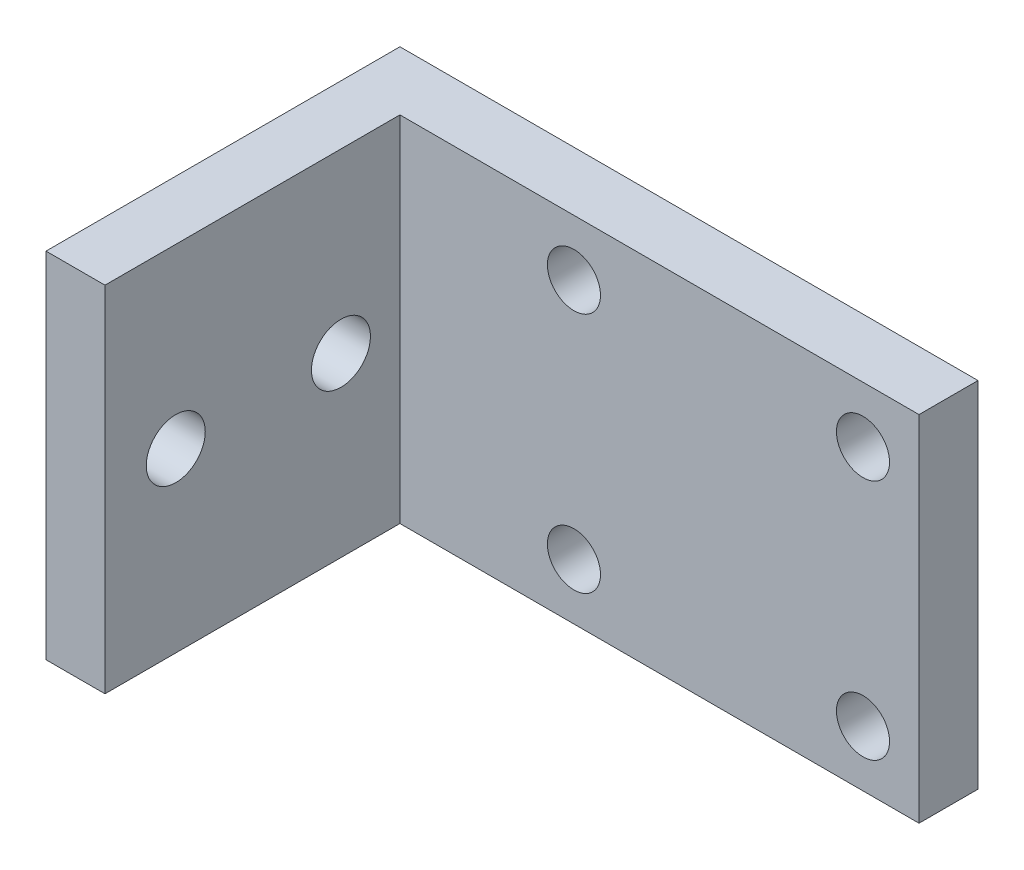
ISO-10303-21;
HEADER;
FILE_DESCRIPTION(('STEP AP214'),'2;1');
FILE_NAME('part.step','',(''),(''),'','','');
FILE_SCHEMA(('AUTOMOTIVE_DESIGN { 1 0 10303 214 1 1 1 1 }'));
ENDSEC;
DATA;
#1=APPLICATION_CONTEXT('core data for automotive mechanical design processes');
#2=APPLICATION_PROTOCOL_DEFINITION('international standard','automotive_design',2000,#1);
#3=PRODUCT_CONTEXT('',#1,'mechanical');
#4=PRODUCT('Part','Part','',(#3));
#5=PRODUCT_RELATED_PRODUCT_CATEGORY('part','',(#4));
#6=PRODUCT_DEFINITION_FORMATION('','',#4);
#7=PRODUCT_DEFINITION_CONTEXT('part definition',#1,'design');
#8=PRODUCT_DEFINITION('design','',#6,#7);
#9=PRODUCT_DEFINITION_SHAPE('','',#8);
#10=(LENGTH_UNIT() NAMED_UNIT(*) SI_UNIT(.MILLI.,.METRE.));
#11=(NAMED_UNIT(*) PLANE_ANGLE_UNIT() SI_UNIT($,.RADIAN.));
#12=(NAMED_UNIT(*) SI_UNIT($,.STERADIAN.) SOLID_ANGLE_UNIT());
#13=UNCERTAINTY_MEASURE_WITH_UNIT(LENGTH_MEASURE(1.E-05),#10,'distance_accuracy_value','');
#14=(GEOMETRIC_REPRESENTATION_CONTEXT(3) GLOBAL_UNCERTAINTY_ASSIGNED_CONTEXT((#13)) GLOBAL_UNIT_ASSIGNED_CONTEXT((#10,
#11,#12)) REPRESENTATION_CONTEXT('',''));
#15=CARTESIAN_POINT('',(0.,0.,0.));
#16=DIRECTION('',(0.,0.,1.));
#17=DIRECTION('',(1.,0.,0.));
#18=AXIS2_PLACEMENT_3D('',#15,#16,#17);
#19=CARTESIAN_POINT('',(0.,0.,5.));
#20=DIRECTION('',(0.,0.,-1.));
#21=DIRECTION('',(-1.,0.,0.));
#22=AXIS2_PLACEMENT_3D('',#19,#20,#21);
#23=PLANE('',#22);
#24=CARTESIAN_POINT('',(4.75,4.75,5.));
#25=DIRECTION('',(0.,0.,1.));
#26=DIRECTION('',(1.,0.,0.));
#27=AXIS2_PLACEMENT_3D('',#24,#25,#26);
#28=CIRCLE('',#27,2.25);
#29=CARTESIAN_POINT('',(7.,4.75,5.));
#30=VERTEX_POINT('',#29);
#31=EDGE_CURVE('E116',#30,#30,#28,.T.);
#32=ORIENTED_EDGE('',*,*,#31,.F.);
#33=EDGE_LOOP('',(#32));
#34=FACE_BOUND('',#33,.T.);
#35=CARTESIAN_POINT('',(29.25,4.75,5.));
#36=DIRECTION('',(0.,0.,1.));
#37=DIRECTION('',(1.,0.,0.));
#38=AXIS2_PLACEMENT_3D('',#35,#36,#37);
#39=CIRCLE('',#38,2.25);
#40=CARTESIAN_POINT('',(31.5,4.75,5.));
#41=VERTEX_POINT('',#40);
#42=EDGE_CURVE('E110',#41,#41,#39,.T.);
#43=ORIENTED_EDGE('',*,*,#42,.F.);
#44=EDGE_LOOP('',(#43));
#45=FACE_BOUND('',#44,.T.);
#46=CARTESIAN_POINT('',(29.25,25.25,5.));
#47=DIRECTION('',(0.,0.,1.));
#48=DIRECTION('',(1.,0.,0.));
#49=AXIS2_PLACEMENT_3D('',#46,#47,#48);
#50=CIRCLE('',#49,2.25000000000001);
#51=CARTESIAN_POINT('',(31.5,25.25,5.));
#52=VERTEX_POINT('',#51);
#53=EDGE_CURVE('E104',#52,#52,#50,.T.);
#54=ORIENTED_EDGE('',*,*,#53,.F.);
#55=EDGE_LOOP('',(#54));
#56=FACE_BOUND('',#55,.T.);
#57=CARTESIAN_POINT('',(4.75,25.25,5.));
#58=DIRECTION('',(0.,0.,1.));
#59=DIRECTION('',(1.,0.,0.));
#60=AXIS2_PLACEMENT_3D('',#57,#58,#59);
#61=CIRCLE('',#60,2.25);
#62=CARTESIAN_POINT('',(7.,25.25,5.));
#63=VERTEX_POINT('',#62);
#64=EDGE_CURVE('E98',#63,#63,#61,.T.);
#65=ORIENTED_EDGE('',*,*,#64,.F.);
#66=EDGE_LOOP('',(#65));
#67=FACE_BOUND('',#66,.T.);
#68=DIRECTION('',(0.,1.,0.));
#69=VECTOR('',#68,1.);
#70=CARTESIAN_POINT('',(-10.,0.,5.));
#71=LINE('',#70,#69);
#72=CARTESIAN_POINT('',(-10.,0.,5.));
#73=VERTEX_POINT('',#72);
#74=CARTESIAN_POINT('',(-10.,30.,5.));
#75=VERTEX_POINT('',#74);
#76=EDGE_CURVE('E52',#73,#75,#71,.T.);
#77=ORIENTED_EDGE('',*,*,#76,.F.);
#78=DIRECTION('',(1.,0.,0.));
#79=VECTOR('',#78,1.);
#80=CARTESIAN_POINT('',(0.,0.,5.));
#81=LINE('',#80,#79);
#82=CARTESIAN_POINT('',(34.,0.,5.));
#83=VERTEX_POINT('',#82);
#84=EDGE_CURVE('E93',#73,#83,#81,.T.);
#85=ORIENTED_EDGE('',*,*,#84,.T.);
#86=DIRECTION('',(0.,1.,0.));
#87=VECTOR('',#86,1.);
#88=CARTESIAN_POINT('',(34.,0.,5.));
#89=LINE('',#88,#87);
#90=CARTESIAN_POINT('',(34.,30.,5.));
#91=VERTEX_POINT('',#90);
#92=EDGE_CURVE('E58',#83,#91,#89,.T.);
#93=ORIENTED_EDGE('',*,*,#92,.T.);
#94=DIRECTION('',(-1.,0.,0.));
#95=VECTOR('',#94,1.);
#96=CARTESIAN_POINT('',(0.,30.,5.));
#97=LINE('',#96,#95);
#98=EDGE_CURVE('E87',#91,#75,#97,.T.);
#99=ORIENTED_EDGE('',*,*,#98,.T.);
#100=EDGE_LOOP('',(#77,#85,#93,#99));
#101=FACE_BOUND('',#100,.T.);
#102=ADVANCED_FACE('F37',(#34,#45,#56,#67,#101),#23,.F.);
#103=CARTESIAN_POINT('',(0.,0.,0.));
#104=DIRECTION('',(0.,0.,-1.));
#105=DIRECTION('',(-1.,0.,0.));
#106=AXIS2_PLACEMENT_3D('',#103,#104,#105);
#107=PLANE('',#106);
#108=CARTESIAN_POINT('',(29.25,4.75,0.));
#109=DIRECTION('',(0.,0.,1.));
#110=DIRECTION('',(1.,0.,0.));
#111=AXIS2_PLACEMENT_3D('',#108,#109,#110);
#112=CIRCLE('',#111,2.25);
#113=CARTESIAN_POINT('',(31.5,4.75,0.));
#114=VERTEX_POINT('',#113);
#115=EDGE_CURVE('E113',#114,#114,#112,.T.);
#116=ORIENTED_EDGE('',*,*,#115,.T.);
#117=EDGE_LOOP('',(#116));
#118=FACE_BOUND('',#117,.T.);
#119=CARTESIAN_POINT('',(4.75,25.25,0.));
#120=DIRECTION('',(0.,0.,1.));
#121=DIRECTION('',(1.,0.,0.));
#122=AXIS2_PLACEMENT_3D('',#119,#120,#121);
#123=CIRCLE('',#122,2.25);
#124=CARTESIAN_POINT('',(7.,25.25,0.));
#125=VERTEX_POINT('',#124);
#126=EDGE_CURVE('E101',#125,#125,#123,.T.);
#127=ORIENTED_EDGE('',*,*,#126,.T.);
#128=EDGE_LOOP('',(#127));
#129=FACE_BOUND('',#128,.T.);
#130=DIRECTION('',(1.,0.,0.));
#131=VECTOR('',#130,1.);
#132=CARTESIAN_POINT('',(0.,0.,0.));
#133=LINE('',#132,#131);
#134=CARTESIAN_POINT('',(-15.,0.,0.));
#135=VERTEX_POINT('',#134);
#136=CARTESIAN_POINT('',(34.,0.,0.));
#137=VERTEX_POINT('',#136);
#138=EDGE_CURVE('E79',#135,#137,#133,.T.);
#139=ORIENTED_EDGE('',*,*,#138,.F.);
#140=DIRECTION('',(0.,-1.,0.));
#141=VECTOR('',#140,1.);
#142=CARTESIAN_POINT('',(-15.,30.,0.));
#143=LINE('',#142,#141);
#144=CARTESIAN_POINT('',(-15.,30.,0.));
#145=VERTEX_POINT('',#144);
#146=EDGE_CURVE('E92',#145,#135,#143,.T.);
#147=ORIENTED_EDGE('',*,*,#146,.F.);
#148=DIRECTION('',(-1.,0.,0.));
#149=VECTOR('',#148,1.);
#150=CARTESIAN_POINT('',(0.,30.,0.));
#151=LINE('',#150,#149);
#152=CARTESIAN_POINT('',(34.,30.,0.));
#153=VERTEX_POINT('',#152);
#154=EDGE_CURVE('E78',#153,#145,#151,.T.);
#155=ORIENTED_EDGE('',*,*,#154,.F.);
#156=DIRECTION('',(0.,1.,0.));
#157=VECTOR('',#156,1.);
#158=CARTESIAN_POINT('',(34.,0.,0.));
#159=LINE('',#158,#157);
#160=EDGE_CURVE('E70',#137,#153,#159,.T.);
#161=ORIENTED_EDGE('',*,*,#160,.F.);
#162=EDGE_LOOP('',(#139,#147,#155,#161));
#163=FACE_BOUND('',#162,.T.);
#164=CARTESIAN_POINT('',(29.25,25.25,0.));
#165=DIRECTION('',(0.,0.,1.));
#166=DIRECTION('',(1.,0.,0.));
#167=AXIS2_PLACEMENT_3D('',#164,#165,#166);
#168=CIRCLE('',#167,2.25000000000001);
#169=CARTESIAN_POINT('',(31.5,25.25,0.));
#170=VERTEX_POINT('',#169);
#171=EDGE_CURVE('E107',#170,#170,#168,.T.);
#172=ORIENTED_EDGE('',*,*,#171,.T.);
#173=EDGE_LOOP('',(#172));
#174=FACE_BOUND('',#173,.T.);
#175=CARTESIAN_POINT('',(4.75,4.75,0.));
#176=DIRECTION('',(0.,0.,1.));
#177=DIRECTION('',(1.,0.,0.));
#178=AXIS2_PLACEMENT_3D('',#175,#176,#177);
#179=CIRCLE('',#178,2.25);
#180=CARTESIAN_POINT('',(7.,4.75,0.));
#181=VERTEX_POINT('',#180);
#182=EDGE_CURVE('E119',#181,#181,#179,.T.);
#183=ORIENTED_EDGE('',*,*,#182,.T.);
#184=EDGE_LOOP('',(#183));
#185=FACE_BOUND('',#184,.T.);
#186=ADVANCED_FACE('F89',(#118,#129,#163,#174,#185),#107,.T.);
#187=CARTESIAN_POINT('',(0.,0.,5.));
#188=DIRECTION('',(0.,1.,0.));
#189=DIRECTION('',(0.,0.,1.));
#190=AXIS2_PLACEMENT_3D('',#187,#188,#189);
#191=PLANE('',#190);
#192=ORIENTED_EDGE('',*,*,#138,.T.);
#193=DIRECTION('',(0.,0.,-1.));
#194=VECTOR('',#193,1.);
#195=CARTESIAN_POINT('',(34.,0.,5.));
#196=LINE('',#195,#194);
#197=EDGE_CURVE('E11',#83,#137,#196,.T.);
#198=ORIENTED_EDGE('',*,*,#197,.F.);
#199=ORIENTED_EDGE('',*,*,#84,.F.);
#200=DIRECTION('',(0.,0.,-1.));
#201=VECTOR('',#200,1.);
#202=CARTESIAN_POINT('',(-10.,0.,30.));
#203=LINE('',#202,#201);
#204=CARTESIAN_POINT('',(-10.,0.,30.));
#205=VERTEX_POINT('',#204);
#206=EDGE_CURVE('E130',#205,#73,#203,.T.);
#207=ORIENTED_EDGE('',*,*,#206,.F.);
#208=DIRECTION('',(1.,0.,0.));
#209=VECTOR('',#208,1.);
#210=CARTESIAN_POINT('',(-15.,0.,30.));
#211=LINE('',#210,#209);
#212=CARTESIAN_POINT('',(-15.,0.,30.));
#213=VERTEX_POINT('',#212);
#214=EDGE_CURVE('E144',#213,#205,#211,.T.);
#215=ORIENTED_EDGE('',*,*,#214,.F.);
#216=DIRECTION('',(0.,0.,1.));
#217=VECTOR('',#216,1.);
#218=CARTESIAN_POINT('',(-15.,0.,0.));
#219=LINE('',#218,#217);
#220=EDGE_CURVE('E126',#135,#213,#219,.T.);
#221=ORIENTED_EDGE('',*,*,#220,.F.);
#222=EDGE_LOOP('',(#192,#198,#199,#207,#215,#221));
#223=FACE_BOUND('',#222,.T.);
#224=ADVANCED_FACE('F39',(#223),#191,.F.);
#225=CARTESIAN_POINT('',(34.,0.,5.));
#226=DIRECTION('',(-1.,0.,0.));
#227=DIRECTION('',(0.,-1.,0.));
#228=AXIS2_PLACEMENT_3D('',#225,#226,#227);
#229=PLANE('',#228);
#230=ORIENTED_EDGE('',*,*,#160,.T.);
#231=DIRECTION('',(0.,0.,-1.));
#232=VECTOR('',#231,1.);
#233=CARTESIAN_POINT('',(34.,30.,5.));
#234=LINE('',#233,#232);
#235=EDGE_CURVE('E45',#91,#153,#234,.T.);
#236=ORIENTED_EDGE('',*,*,#235,.F.);
#237=ORIENTED_EDGE('',*,*,#92,.F.);
#238=ORIENTED_EDGE('',*,*,#197,.T.);
#239=EDGE_LOOP('',(#230,#236,#237,#238));
#240=FACE_BOUND('',#239,.T.);
#241=ADVANCED_FACE('F72',(#240),#229,.F.);
#242=CARTESIAN_POINT('',(0.,30.,5.));
#243=DIRECTION('',(0.,-1.,0.));
#244=DIRECTION('',(0.,0.,-1.));
#245=AXIS2_PLACEMENT_3D('',#242,#243,#244);
#246=PLANE('',#245);
#247=ORIENTED_EDGE('',*,*,#154,.T.);
#248=DIRECTION('',(0.,0.,-1.));
#249=VECTOR('',#248,1.);
#250=CARTESIAN_POINT('',(-15.,30.,0.));
#251=LINE('',#250,#249);
#252=CARTESIAN_POINT('',(-15.,30.,30.));
#253=VERTEX_POINT('',#252);
#254=EDGE_CURVE('E122',#253,#145,#251,.T.);
#255=ORIENTED_EDGE('',*,*,#254,.F.);
#256=DIRECTION('',(-1.,0.,0.));
#257=VECTOR('',#256,1.);
#258=CARTESIAN_POINT('',(-15.,30.,30.));
#259=LINE('',#258,#257);
#260=CARTESIAN_POINT('',(-10.,30.,30.));
#261=VERTEX_POINT('',#260);
#262=EDGE_CURVE('E135',#261,#253,#259,.T.);
#263=ORIENTED_EDGE('',*,*,#262,.F.);
#264=DIRECTION('',(0.,0.,-1.));
#265=VECTOR('',#264,1.);
#266=CARTESIAN_POINT('',(-10.,30.,30.));
#267=LINE('',#266,#265);
#268=EDGE_CURVE('E133',#261,#75,#267,.T.);
#269=ORIENTED_EDGE('',*,*,#268,.T.);
#270=ORIENTED_EDGE('',*,*,#98,.F.);
#271=ORIENTED_EDGE('',*,*,#235,.T.);
#272=EDGE_LOOP('',(#247,#255,#263,#269,#270,#271));
#273=FACE_BOUND('',#272,.T.);
#274=ADVANCED_FACE('F83',(#273),#246,.F.);
#275=CARTESIAN_POINT('',(4.75,25.25,5.));
#276=DIRECTION('',(0.,0.,-1.));
#277=DIRECTION('',(-1.,0.,0.));
#278=AXIS2_PLACEMENT_3D('',#275,#276,#277);
#279=CYLINDRICAL_SURFACE('',#278,2.25);
#280=ORIENTED_EDGE('',*,*,#64,.T.);
#281=EDGE_LOOP('',(#280));
#282=FACE_BOUND('',#281,.T.);
#283=ORIENTED_EDGE('',*,*,#126,.F.);
#284=EDGE_LOOP('',(#283));
#285=FACE_BOUND('',#284,.T.);
#286=ADVANCED_FACE('F204',(#282,#285),#279,.F.);
#287=CARTESIAN_POINT('',(29.25,25.25,5.));
#288=DIRECTION('',(0.,0.,-1.));
#289=DIRECTION('',(-1.,0.,0.));
#290=AXIS2_PLACEMENT_3D('',#287,#288,#289);
#291=CYLINDRICAL_SURFACE('',#290,2.25000000000001);
#292=ORIENTED_EDGE('',*,*,#53,.T.);
#293=EDGE_LOOP('',(#292));
#294=FACE_BOUND('',#293,.T.);
#295=ORIENTED_EDGE('',*,*,#171,.F.);
#296=EDGE_LOOP('',(#295));
#297=FACE_BOUND('',#296,.T.);
#298=ADVANCED_FACE('F300',(#294,#297),#291,.F.);
#299=CARTESIAN_POINT('',(29.25,4.75,5.));
#300=DIRECTION('',(0.,0.,-1.));
#301=DIRECTION('',(-1.,0.,0.));
#302=AXIS2_PLACEMENT_3D('',#299,#300,#301);
#303=CYLINDRICAL_SURFACE('',#302,2.25);
#304=ORIENTED_EDGE('',*,*,#42,.T.);
#305=EDGE_LOOP('',(#304));
#306=FACE_BOUND('',#305,.T.);
#307=ORIENTED_EDGE('',*,*,#115,.F.);
#308=EDGE_LOOP('',(#307));
#309=FACE_BOUND('',#308,.T.);
#310=ADVANCED_FACE('F307',(#306,#309),#303,.F.);
#311=CARTESIAN_POINT('',(4.75,4.75,5.));
#312=DIRECTION('',(0.,0.,-1.));
#313=DIRECTION('',(-1.,0.,0.));
#314=AXIS2_PLACEMENT_3D('',#311,#312,#313);
#315=CYLINDRICAL_SURFACE('',#314,2.25);
#316=ORIENTED_EDGE('',*,*,#31,.T.);
#317=EDGE_LOOP('',(#316));
#318=FACE_BOUND('',#317,.T.);
#319=ORIENTED_EDGE('',*,*,#182,.F.);
#320=EDGE_LOOP('',(#319));
#321=FACE_BOUND('',#320,.T.);
#322=ADVANCED_FACE('F227',(#318,#321),#315,.F.);
#323=CARTESIAN_POINT('',(-15.,0.,0.));
#324=DIRECTION('',(-1.,0.,0.));
#325=DIRECTION('',(0.,-1.,0.));
#326=AXIS2_PLACEMENT_3D('',#323,#324,#325);
#327=PLANE('',#326);
#328=CARTESIAN_POINT('',(-15.,15.,24.));
#329=DIRECTION('',(-1.,0.,0.));
#330=DIRECTION('',(0.,-1.,0.));
#331=AXIS2_PLACEMENT_3D('',#328,#329,#330);
#332=CIRCLE('',#331,2.5);
#333=CARTESIAN_POINT('',(-15.,12.5,24.));
#334=VERTEX_POINT('',#333);
#335=EDGE_CURVE('E138',#334,#334,#332,.T.);
#336=ORIENTED_EDGE('',*,*,#335,.F.);
#337=EDGE_LOOP('',(#336));
#338=FACE_BOUND('',#337,.T.);
#339=CARTESIAN_POINT('',(-15.,15.,10.));
#340=DIRECTION('',(-1.,0.,0.));
#341=DIRECTION('',(0.,-1.,0.));
#342=AXIS2_PLACEMENT_3D('',#339,#340,#341);
#343=CIRCLE('',#342,2.5);
#344=CARTESIAN_POINT('',(-15.,12.5,10.));
#345=VERTEX_POINT('',#344);
#346=EDGE_CURVE('E151',#345,#345,#343,.T.);
#347=ORIENTED_EDGE('',*,*,#346,.F.);
#348=EDGE_LOOP('',(#347));
#349=FACE_BOUND('',#348,.T.);
#350=ORIENTED_EDGE('',*,*,#146,.T.);
#351=ORIENTED_EDGE('',*,*,#220,.T.);
#352=DIRECTION('',(0.,-1.,0.));
#353=VECTOR('',#352,1.);
#354=CARTESIAN_POINT('',(-15.,0.,30.));
#355=LINE('',#354,#353);
#356=EDGE_CURVE('E137',#253,#213,#355,.T.);
#357=ORIENTED_EDGE('',*,*,#356,.F.);
#358=ORIENTED_EDGE('',*,*,#254,.T.);
#359=EDGE_LOOP('',(#350,#351,#357,#358));
#360=FACE_BOUND('',#359,.T.);
#361=ADVANCED_FACE('F167',(#338,#349,#360),#327,.T.);
#362=CARTESIAN_POINT('',(-10.,0.,30.));
#363=DIRECTION('',(-1.,0.,0.));
#364=DIRECTION('',(0.,0.,1.));
#365=AXIS2_PLACEMENT_3D('',#362,#363,#364);
#366=PLANE('',#365);
#367=CARTESIAN_POINT('',(-10.,15.,24.));
#368=DIRECTION('',(1.,0.,0.));
#369=DIRECTION('',(0.,0.,-1.));
#370=AXIS2_PLACEMENT_3D('',#367,#368,#369);
#371=CIRCLE('',#370,2.5);
#372=CARTESIAN_POINT('',(-10.,15.,21.5));
#373=VERTEX_POINT('',#372);
#374=EDGE_CURVE('E154',#373,#373,#371,.T.);
#375=ORIENTED_EDGE('',*,*,#374,.F.);
#376=EDGE_LOOP('',(#375));
#377=FACE_BOUND('',#376,.T.);
#378=CARTESIAN_POINT('',(-10.,15.,10.));
#379=DIRECTION('',(1.,0.,0.));
#380=DIRECTION('',(0.,0.,-1.));
#381=AXIS2_PLACEMENT_3D('',#378,#379,#380);
#382=CIRCLE('',#381,2.5);
#383=CARTESIAN_POINT('',(-10.,15.,7.5));
#384=VERTEX_POINT('',#383);
#385=EDGE_CURVE('E155',#384,#384,#382,.T.);
#386=ORIENTED_EDGE('',*,*,#385,.F.);
#387=EDGE_LOOP('',(#386));
#388=FACE_BOUND('',#387,.T.);
#389=ORIENTED_EDGE('',*,*,#76,.T.);
#390=ORIENTED_EDGE('',*,*,#268,.F.);
#391=DIRECTION('',(0.,1.,0.));
#392=VECTOR('',#391,1.);
#393=CARTESIAN_POINT('',(-10.,0.,30.));
#394=LINE('',#393,#392);
#395=EDGE_CURVE('E141',#205,#261,#394,.T.);
#396=ORIENTED_EDGE('',*,*,#395,.F.);
#397=ORIENTED_EDGE('',*,*,#206,.T.);
#398=EDGE_LOOP('',(#389,#390,#396,#397));
#399=FACE_BOUND('',#398,.T.);
#400=ADVANCED_FACE('F163',(#377,#388,#399),#366,.F.);
#401=CARTESIAN_POINT('',(0.,0.,30.));
#402=DIRECTION('',(0.,0.,-1.));
#403=DIRECTION('',(-1.,0.,0.));
#404=AXIS2_PLACEMENT_3D('',#401,#402,#403);
#405=PLANE('',#404);
#406=ORIENTED_EDGE('',*,*,#356,.T.);
#407=ORIENTED_EDGE('',*,*,#214,.T.);
#408=ORIENTED_EDGE('',*,*,#395,.T.);
#409=ORIENTED_EDGE('',*,*,#262,.T.);
#410=EDGE_LOOP('',(#406,#407,#408,#409));
#411=FACE_BOUND('',#410,.T.);
#412=ADVANCED_FACE('F166',(#411),#405,.F.);
#413=CARTESIAN_POINT('',(-35.,15.,10.));
#414=DIRECTION('',(1.,0.,0.));
#415=DIRECTION('',(0.,0.,-1.));
#416=AXIS2_PLACEMENT_3D('',#413,#414,#415);
#417=CYLINDRICAL_SURFACE('',#416,2.5);
#418=ORIENTED_EDGE('',*,*,#346,.T.);
#419=EDGE_LOOP('',(#418));
#420=FACE_BOUND('',#419,.T.);
#421=ORIENTED_EDGE('',*,*,#385,.T.);
#422=EDGE_LOOP('',(#421));
#423=FACE_BOUND('',#422,.T.);
#424=ADVANCED_FACE('F254',(#420,#423),#417,.F.);
#425=CARTESIAN_POINT('',(-35.,15.,24.));
#426=DIRECTION('',(1.,0.,0.));
#427=DIRECTION('',(0.,0.,-1.));
#428=AXIS2_PLACEMENT_3D('',#425,#426,#427);
#429=CYLINDRICAL_SURFACE('',#428,2.5);
#430=ORIENTED_EDGE('',*,*,#335,.T.);
#431=EDGE_LOOP('',(#430));
#432=FACE_BOUND('',#431,.T.);
#433=ORIENTED_EDGE('',*,*,#374,.T.);
#434=EDGE_LOOP('',(#433));
#435=FACE_BOUND('',#434,.T.);
#436=ADVANCED_FACE('F161',(#432,#435),#429,.F.);
#437=CLOSED_SHELL('',(#102,#186,#224,#241,#274,#286,#298,#310,#322,#361,#400,#412,#424,#436));
#438=MANIFOLD_SOLID_BREP('B2',#437);
#439=ADVANCED_BREP_SHAPE_REPRESENTATION('',(#18,#438),#14);
#440=SHAPE_DEFINITION_REPRESENTATION(#9,#439);
ENDSEC;
END-ISO-10303-21;
